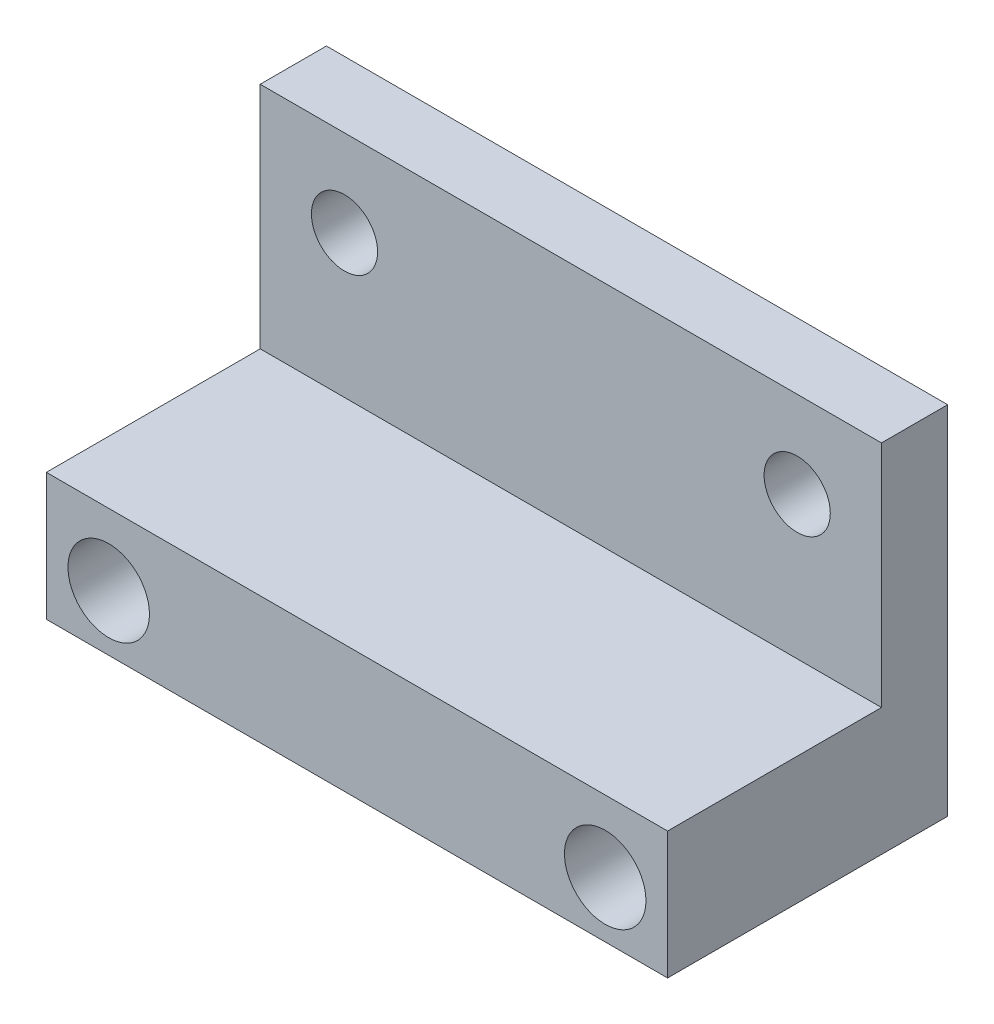
ISO-10303-21;
HEADER;
FILE_DESCRIPTION(('STEP AP214'),'2;1');
FILE_NAME('part.step','',(''),(''),'','','');
FILE_SCHEMA(('AUTOMOTIVE_DESIGN { 1 0 10303 214 1 1 1 1 }'));
ENDSEC;
DATA;
#1=APPLICATION_CONTEXT('core data for automotive mechanical design processes');
#2=APPLICATION_PROTOCOL_DEFINITION('international standard','automotive_design',2000,#1);
#3=PRODUCT_CONTEXT('',#1,'mechanical');
#4=PRODUCT('Part','Part','',(#3));
#5=PRODUCT_RELATED_PRODUCT_CATEGORY('part','',(#4));
#6=PRODUCT_DEFINITION_FORMATION('','',#4);
#7=PRODUCT_DEFINITION_CONTEXT('part definition',#1,'design');
#8=PRODUCT_DEFINITION('design','',#6,#7);
#9=PRODUCT_DEFINITION_SHAPE('','',#8);
#10=(LENGTH_UNIT() NAMED_UNIT(*) SI_UNIT(.MILLI.,.METRE.));
#11=(NAMED_UNIT(*) PLANE_ANGLE_UNIT() SI_UNIT($,.RADIAN.));
#12=(NAMED_UNIT(*) SI_UNIT($,.STERADIAN.) SOLID_ANGLE_UNIT());
#13=UNCERTAINTY_MEASURE_WITH_UNIT(LENGTH_MEASURE(1.E-05),#10,'distance_accuracy_value','');
#14=(GEOMETRIC_REPRESENTATION_CONTEXT(3) GLOBAL_UNCERTAINTY_ASSIGNED_CONTEXT((#13)) GLOBAL_UNIT_ASSIGNED_CONTEXT((#10,
#11,#12)) REPRESENTATION_CONTEXT('',''));
#15=CARTESIAN_POINT('',(0.,0.,0.));
#16=DIRECTION('',(0.,0.,1.));
#17=DIRECTION('',(1.,0.,0.));
#18=AXIS2_PLACEMENT_3D('',#15,#16,#17);
#19=CARTESIAN_POINT('',(0.,0.,2.6));
#20=DIRECTION('',(0.,0.,-1.));
#21=DIRECTION('',(-1.,0.,0.));
#22=AXIS2_PLACEMENT_3D('',#19,#20,#21);
#23=PLANE('',#22);
#24=CARTESIAN_POINT('',(8.89,10.6,2.6));
#25=DIRECTION('',(0.,0.,1.));
#26=DIRECTION('',(1.,0.,0.));
#27=AXIS2_PLACEMENT_3D('',#24,#25,#26);
#28=CIRCLE('',#27,1.3);
#29=CARTESIAN_POINT('',(10.19,10.6,2.6));
#30=VERTEX_POINT('',#29);
#31=EDGE_CURVE('E123',#30,#30,#28,.T.);
#32=ORIENTED_EDGE('',*,*,#31,.F.);
#33=EDGE_LOOP('',(#32));
#34=FACE_BOUND('',#33,.T.);
#35=CARTESIAN_POINT('',(-8.89,10.6,2.6));
#36=DIRECTION('',(0.,0.,1.));
#37=DIRECTION('',(1.,0.,0.));
#38=AXIS2_PLACEMENT_3D('',#35,#36,#37);
#39=CIRCLE('',#38,1.3);
#40=CARTESIAN_POINT('',(-7.59,10.6,2.6));
#41=VERTEX_POINT('',#40);
#42=EDGE_CURVE('E129',#41,#41,#39,.T.);
#43=ORIENTED_EDGE('',*,*,#42,.F.);
#44=EDGE_LOOP('',(#43));
#45=FACE_BOUND('',#44,.T.);
#46=DIRECTION('',(-1.,0.,0.));
#47=VECTOR('',#46,1.);
#48=CARTESIAN_POINT('',(0.,5.,2.6));
#49=LINE('',#48,#47);
#50=CARTESIAN_POINT('',(12.2,5.,2.6));
#51=VERTEX_POINT('',#50);
#52=CARTESIAN_POINT('',(-12.2,5.,2.6));
#53=VERTEX_POINT('',#52);
#54=EDGE_CURVE('E60',#51,#53,#49,.T.);
#55=ORIENTED_EDGE('',*,*,#54,.F.);
#56=DIRECTION('',(0.,1.,0.));
#57=VECTOR('',#56,1.);
#58=CARTESIAN_POINT('',(12.2,0.,2.6));
#59=LINE('',#58,#57);
#60=CARTESIAN_POINT('',(12.2,14.,2.6));
#61=VERTEX_POINT('',#60);
#62=EDGE_CURVE('E116',#51,#61,#59,.T.);
#63=ORIENTED_EDGE('',*,*,#62,.T.);
#64=DIRECTION('',(-1.,0.,0.));
#65=VECTOR('',#64,1.);
#66=CARTESIAN_POINT('',(-12.2,14.,2.6));
#67=LINE('',#66,#65);
#68=CARTESIAN_POINT('',(-12.2,14.,2.6));
#69=VERTEX_POINT('',#68);
#70=EDGE_CURVE('E138',#61,#69,#67,.T.);
#71=ORIENTED_EDGE('',*,*,#70,.T.);
#72=DIRECTION('',(0.,-1.,0.));
#73=VECTOR('',#72,1.);
#74=CARTESIAN_POINT('',(-12.2,0.,2.6));
#75=LINE('',#74,#73);
#76=EDGE_CURVE('E56',#69,#53,#75,.T.);
#77=ORIENTED_EDGE('',*,*,#76,.T.);
#78=EDGE_LOOP('',(#55,#63,#71,#77));
#79=FACE_BOUND('',#78,.T.);
#80=ADVANCED_FACE('F41',(#34,#45,#79),#23,.F.);
#81=CARTESIAN_POINT('',(0.,0.,0.));
#82=DIRECTION('',(0.,0.,-1.));
#83=DIRECTION('',(-1.,0.,0.));
#84=AXIS2_PLACEMENT_3D('',#81,#82,#83);
#85=PLANE('',#84);
#86=DIRECTION('',(1.,0.,0.));
#87=VECTOR('',#86,1.);
#88=CARTESIAN_POINT('',(-12.2,0.,0.));
#89=LINE('',#88,#87);
#90=CARTESIAN_POINT('',(-12.2,0.,0.));
#91=VERTEX_POINT('',#90);
#92=CARTESIAN_POINT('',(12.2,0.,0.));
#93=VERTEX_POINT('',#92);
#94=EDGE_CURVE('E142',#91,#93,#89,.T.);
#95=ORIENTED_EDGE('',*,*,#94,.F.);
#96=DIRECTION('',(0.,-1.,0.));
#97=VECTOR('',#96,1.);
#98=CARTESIAN_POINT('',(-12.2,0.,0.));
#99=LINE('',#98,#97);
#100=CARTESIAN_POINT('',(-12.2,14.,0.));
#101=VERTEX_POINT('',#100);
#102=EDGE_CURVE('E132',#101,#91,#99,.T.);
#103=ORIENTED_EDGE('',*,*,#102,.F.);
#104=DIRECTION('',(-1.,0.,0.));
#105=VECTOR('',#104,1.);
#106=CARTESIAN_POINT('',(-12.2,14.,0.));
#107=LINE('',#106,#105);
#108=CARTESIAN_POINT('',(12.2,14.,0.));
#109=VERTEX_POINT('',#108);
#110=EDGE_CURVE('E136',#109,#101,#107,.T.);
#111=ORIENTED_EDGE('',*,*,#110,.F.);
#112=DIRECTION('',(0.,1.,0.));
#113=VECTOR('',#112,1.);
#114=CARTESIAN_POINT('',(12.2,0.,0.));
#115=LINE('',#114,#113);
#116=EDGE_CURVE('E144',#93,#109,#115,.T.);
#117=ORIENTED_EDGE('',*,*,#116,.F.);
#118=EDGE_LOOP('',(#95,#103,#111,#117));
#119=FACE_BOUND('',#118,.T.);
#120=CARTESIAN_POINT('',(-8.89,10.6,0.));
#121=DIRECTION('',(0.,0.,1.));
#122=DIRECTION('',(1.,0.,0.));
#123=AXIS2_PLACEMENT_3D('',#120,#121,#122);
#124=CIRCLE('',#123,1.3);
#125=CARTESIAN_POINT('',(-7.59,10.6,0.));
#126=VERTEX_POINT('',#125);
#127=EDGE_CURVE('E126',#126,#126,#124,.T.);
#128=ORIENTED_EDGE('',*,*,#127,.T.);
#129=EDGE_LOOP('',(#128));
#130=FACE_BOUND('',#129,.T.);
#131=CARTESIAN_POINT('',(8.89,10.6,0.));
#132=DIRECTION('',(0.,0.,1.));
#133=DIRECTION('',(1.,0.,0.));
#134=AXIS2_PLACEMENT_3D('',#131,#132,#133);
#135=CIRCLE('',#134,1.3);
#136=CARTESIAN_POINT('',(10.19,10.6,0.));
#137=VERTEX_POINT('',#136);
#138=EDGE_CURVE('E118',#137,#137,#135,.T.);
#139=ORIENTED_EDGE('',*,*,#138,.T.);
#140=EDGE_LOOP('',(#139));
#141=FACE_BOUND('',#140,.T.);
#142=ADVANCED_FACE('F156',(#119,#130,#141),#85,.T.);
#143=CARTESIAN_POINT('',(-12.2,0.,2.6));
#144=DIRECTION('',(1.,0.,0.));
#145=DIRECTION('',(0.,0.,-1.));
#146=AXIS2_PLACEMENT_3D('',#143,#144,#145);
#147=PLANE('',#146);
#148=DIRECTION('',(0.,0.,-1.));
#149=VECTOR('',#148,1.);
#150=CARTESIAN_POINT('',(-12.2,0.,2.6));
#151=LINE('',#150,#149);
#152=CARTESIAN_POINT('',(-12.2,0.,11.));
#153=VERTEX_POINT('',#152);
#154=EDGE_CURVE('E11',#153,#91,#151,.T.);
#155=ORIENTED_EDGE('',*,*,#154,.F.);
#156=DIRECTION('',(0.,-1.,0.));
#157=VECTOR('',#156,1.);
#158=CARTESIAN_POINT('',(-12.2,5.,11.));
#159=LINE('',#158,#157);
#160=CARTESIAN_POINT('',(-12.2,5.,11.));
#161=VERTEX_POINT('',#160);
#162=EDGE_CURVE('E102',#161,#153,#159,.T.);
#163=ORIENTED_EDGE('',*,*,#162,.F.);
#164=DIRECTION('',(0.,0.,-1.));
#165=VECTOR('',#164,1.);
#166=CARTESIAN_POINT('',(-12.2,5.,11.));
#167=LINE('',#166,#165);
#168=EDGE_CURVE('E98',#161,#53,#167,.T.);
#169=ORIENTED_EDGE('',*,*,#168,.T.);
#170=ORIENTED_EDGE('',*,*,#76,.F.);
#171=DIRECTION('',(0.,0.,-1.));
#172=VECTOR('',#171,1.);
#173=CARTESIAN_POINT('',(-12.2,14.,2.6));
#174=LINE('',#173,#172);
#175=EDGE_CURVE('E140',#69,#101,#174,.T.);
#176=ORIENTED_EDGE('',*,*,#175,.T.);
#177=ORIENTED_EDGE('',*,*,#102,.T.);
#178=EDGE_LOOP('',(#155,#163,#169,#170,#176,#177));
#179=FACE_BOUND('',#178,.T.);
#180=ADVANCED_FACE('F43',(#179),#147,.F.);
#181=CARTESIAN_POINT('',(-12.2,0.,2.6));
#182=DIRECTION('',(0.,1.,0.));
#183=DIRECTION('',(-1.,0.,0.));
#184=AXIS2_PLACEMENT_3D('',#181,#182,#183);
#185=PLANE('',#184);
#186=ORIENTED_EDGE('',*,*,#94,.T.);
#187=DIRECTION('',(0.,0.,-1.));
#188=VECTOR('',#187,1.);
#189=CARTESIAN_POINT('',(12.2,0.,2.6));
#190=LINE('',#189,#188);
#191=CARTESIAN_POINT('',(12.2,0.,11.));
#192=VERTEX_POINT('',#191);
#193=EDGE_CURVE('E49',#192,#93,#190,.T.);
#194=ORIENTED_EDGE('',*,*,#193,.F.);
#195=DIRECTION('',(1.,0.,0.));
#196=VECTOR('',#195,1.);
#197=CARTESIAN_POINT('',(12.2,0.,11.));
#198=LINE('',#197,#196);
#199=EDGE_CURVE('E109',#153,#192,#198,.T.);
#200=ORIENTED_EDGE('',*,*,#199,.F.);
#201=ORIENTED_EDGE('',*,*,#154,.T.);
#202=EDGE_LOOP('',(#186,#194,#200,#201));
#203=FACE_BOUND('',#202,.T.);
#204=ADVANCED_FACE('F218',(#203),#185,.F.);
#205=CARTESIAN_POINT('',(12.2,0.,2.6));
#206=DIRECTION('',(-1.,0.,0.));
#207=DIRECTION('',(0.,-1.,0.));
#208=AXIS2_PLACEMENT_3D('',#205,#206,#207);
#209=PLANE('',#208);
#210=ORIENTED_EDGE('',*,*,#116,.T.);
#211=DIRECTION('',(0.,0.,-1.));
#212=VECTOR('',#211,1.);
#213=CARTESIAN_POINT('',(12.2,14.,2.6));
#214=LINE('',#213,#212);
#215=EDGE_CURVE('E149',#61,#109,#214,.T.);
#216=ORIENTED_EDGE('',*,*,#215,.F.);
#217=ORIENTED_EDGE('',*,*,#62,.F.);
#218=DIRECTION('',(0.,0.,-1.));
#219=VECTOR('',#218,1.);
#220=CARTESIAN_POINT('',(12.2,5.,11.));
#221=LINE('',#220,#219);
#222=CARTESIAN_POINT('',(12.2,5.,11.));
#223=VERTEX_POINT('',#222);
#224=EDGE_CURVE('E96',#223,#51,#221,.T.);
#225=ORIENTED_EDGE('',*,*,#224,.F.);
#226=DIRECTION('',(0.,1.,0.));
#227=VECTOR('',#226,1.);
#228=CARTESIAN_POINT('',(12.2,5.,11.));
#229=LINE('',#228,#227);
#230=EDGE_CURVE('E103',#192,#223,#229,.T.);
#231=ORIENTED_EDGE('',*,*,#230,.F.);
#232=ORIENTED_EDGE('',*,*,#193,.T.);
#233=EDGE_LOOP('',(#210,#216,#217,#225,#231,#232));
#234=FACE_BOUND('',#233,.T.);
#235=ADVANCED_FACE('F114',(#234),#209,.F.);
#236=CARTESIAN_POINT('',(-12.2,14.,2.6));
#237=DIRECTION('',(0.,-1.,0.));
#238=DIRECTION('',(1.,0.,0.));
#239=AXIS2_PLACEMENT_3D('',#236,#237,#238);
#240=PLANE('',#239);
#241=ORIENTED_EDGE('',*,*,#110,.T.);
#242=ORIENTED_EDGE('',*,*,#175,.F.);
#243=ORIENTED_EDGE('',*,*,#70,.F.);
#244=ORIENTED_EDGE('',*,*,#215,.T.);
#245=EDGE_LOOP('',(#241,#242,#243,#244));
#246=FACE_BOUND('',#245,.T.);
#247=ADVANCED_FACE('F161',(#246),#240,.F.);
#248=CARTESIAN_POINT('',(-8.89,10.6,2.6));
#249=DIRECTION('',(0.,0.,-1.));
#250=DIRECTION('',(-1.,0.,0.));
#251=AXIS2_PLACEMENT_3D('',#248,#249,#250);
#252=CYLINDRICAL_SURFACE('',#251,1.3);
#253=ORIENTED_EDGE('',*,*,#42,.T.);
#254=EDGE_LOOP('',(#253));
#255=FACE_BOUND('',#254,.T.);
#256=ORIENTED_EDGE('',*,*,#127,.F.);
#257=EDGE_LOOP('',(#256));
#258=FACE_BOUND('',#257,.T.);
#259=ADVANCED_FACE('F212',(#255,#258),#252,.F.);
#260=CARTESIAN_POINT('',(8.89,10.6,2.6));
#261=DIRECTION('',(0.,0.,-1.));
#262=DIRECTION('',(-1.,0.,0.));
#263=AXIS2_PLACEMENT_3D('',#260,#261,#262);
#264=CYLINDRICAL_SURFACE('',#263,1.3);
#265=ORIENTED_EDGE('',*,*,#31,.T.);
#266=EDGE_LOOP('',(#265));
#267=FACE_BOUND('',#266,.T.);
#268=ORIENTED_EDGE('',*,*,#138,.F.);
#269=EDGE_LOOP('',(#268));
#270=FACE_BOUND('',#269,.T.);
#271=ADVANCED_FACE('F242',(#267,#270),#264,.F.);
#272=CARTESIAN_POINT('',(12.2,5.,11.));
#273=DIRECTION('',(0.,-1.,0.));
#274=DIRECTION('',(1.,0.,0.));
#275=AXIS2_PLACEMENT_3D('',#272,#273,#274);
#276=PLANE('',#275);
#277=ORIENTED_EDGE('',*,*,#224,.T.);
#278=ORIENTED_EDGE('',*,*,#54,.T.);
#279=ORIENTED_EDGE('',*,*,#168,.F.);
#280=DIRECTION('',(-1.,0.,0.));
#281=VECTOR('',#280,1.);
#282=CARTESIAN_POINT('',(12.2,5.,11.));
#283=LINE('',#282,#281);
#284=EDGE_CURVE('E92',#223,#161,#283,.T.);
#285=ORIENTED_EDGE('',*,*,#284,.F.);
#286=EDGE_LOOP('',(#277,#278,#279,#285));
#287=FACE_BOUND('',#286,.T.);
#288=ADVANCED_FACE('F94',(#287),#276,.F.);
#289=CARTESIAN_POINT('',(0.,0.,11.));
#290=DIRECTION('',(0.,0.,-1.));
#291=DIRECTION('',(-1.,0.,0.));
#292=AXIS2_PLACEMENT_3D('',#289,#290,#291);
#293=PLANE('',#292);
#294=CARTESIAN_POINT('',(-9.75,2.2,11.));
#295=DIRECTION('',(0.,0.,1.));
#296=DIRECTION('',(1.,0.,0.));
#297=AXIS2_PLACEMENT_3D('',#294,#295,#296);
#298=CIRCLE('',#297,1.6);
#299=CARTESIAN_POINT('',(-8.15,2.2,11.));
#300=VERTEX_POINT('',#299);
#301=EDGE_CURVE('E172',#300,#300,#298,.T.);
#302=ORIENTED_EDGE('',*,*,#301,.F.);
#303=EDGE_LOOP('',(#302));
#304=FACE_BOUND('',#303,.T.);
#305=CARTESIAN_POINT('',(9.75,2.2,11.));
#306=DIRECTION('',(0.,0.,1.));
#307=DIRECTION('',(1.,0.,0.));
#308=AXIS2_PLACEMENT_3D('',#305,#306,#307);
#309=CIRCLE('',#308,1.6);
#310=CARTESIAN_POINT('',(11.35,2.2,11.));
#311=VERTEX_POINT('',#310);
#312=EDGE_CURVE('E169',#311,#311,#309,.T.);
#313=ORIENTED_EDGE('',*,*,#312,.F.);
#314=EDGE_LOOP('',(#313));
#315=FACE_BOUND('',#314,.T.);
#316=ORIENTED_EDGE('',*,*,#230,.T.);
#317=ORIENTED_EDGE('',*,*,#284,.T.);
#318=ORIENTED_EDGE('',*,*,#162,.T.);
#319=ORIENTED_EDGE('',*,*,#199,.T.);
#320=EDGE_LOOP('',(#316,#317,#318,#319));
#321=FACE_BOUND('',#320,.T.);
#322=ADVANCED_FACE('F107',(#304,#315,#321),#293,.F.);
#323=CARTESIAN_POINT('',(9.75,2.2,6.4));
#324=DIRECTION('',(0.,0.,1.));
#325=DIRECTION('',(1.,0.,0.));
#326=AXIS2_PLACEMENT_3D('',#323,#324,#325);
#327=CYLINDRICAL_SURFACE('',#326,1.6);
#328=CARTESIAN_POINT('',(9.75,2.2,6.4));
#329=DIRECTION('',(0.,0.,1.));
#330=DIRECTION('',(1.,0.,0.));
#331=AXIS2_PLACEMENT_3D('',#328,#329,#330);
#332=CIRCLE('',#331,1.6);
#333=CARTESIAN_POINT('',(11.35,2.2,6.4));
#334=VERTEX_POINT('',#333);
#335=EDGE_CURVE('E166',#334,#334,#332,.T.);
#336=ORIENTED_EDGE('',*,*,#335,.F.);
#337=EDGE_LOOP('',(#336));
#338=FACE_BOUND('',#337,.T.);
#339=ORIENTED_EDGE('',*,*,#312,.T.);
#340=EDGE_LOOP('',(#339));
#341=FACE_BOUND('',#340,.T.);
#342=ADVANCED_FACE('F189',(#338,#341),#327,.F.);
#343=CARTESIAN_POINT('',(9.75,2.2,6.4));
#344=DIRECTION('',(0.,0.,1.));
#345=DIRECTION('',(1.,0.,0.));
#346=AXIS2_PLACEMENT_3D('',#343,#344,#345);
#347=PLANE('',#346);
#348=ORIENTED_EDGE('',*,*,#335,.T.);
#349=EDGE_LOOP('',(#348));
#350=FACE_BOUND('',#349,.T.);
#351=ADVANCED_FACE('F183',(#350),#347,.T.);
#352=CARTESIAN_POINT('',(-9.75,2.2,6.4));
#353=DIRECTION('',(0.,0.,1.));
#354=DIRECTION('',(1.,0.,0.));
#355=AXIS2_PLACEMENT_3D('',#352,#353,#354);
#356=CYLINDRICAL_SURFACE('',#355,1.6);
#357=CARTESIAN_POINT('',(-9.75,2.2,6.4));
#358=DIRECTION('',(0.,0.,1.));
#359=DIRECTION('',(1.,0.,0.));
#360=AXIS2_PLACEMENT_3D('',#357,#358,#359);
#361=CIRCLE('',#360,1.6);
#362=CARTESIAN_POINT('',(-8.15,2.2,6.4));
#363=VERTEX_POINT('',#362);
#364=EDGE_CURVE('E112',#363,#363,#361,.T.);
#365=ORIENTED_EDGE('',*,*,#364,.F.);
#366=EDGE_LOOP('',(#365));
#367=FACE_BOUND('',#366,.T.);
#368=ORIENTED_EDGE('',*,*,#301,.T.);
#369=EDGE_LOOP('',(#368));
#370=FACE_BOUND('',#369,.T.);
#371=ADVANCED_FACE('F180',(#367,#370),#356,.F.);
#372=CARTESIAN_POINT('',(-9.75,2.2,6.4));
#373=DIRECTION('',(0.,0.,1.));
#374=DIRECTION('',(1.,0.,0.));
#375=AXIS2_PLACEMENT_3D('',#372,#373,#374);
#376=PLANE('',#375);
#377=ORIENTED_EDGE('',*,*,#364,.T.);
#378=EDGE_LOOP('',(#377));
#379=FACE_BOUND('',#378,.T.);
#380=ADVANCED_FACE('F178',(#379),#376,.T.);
#381=CLOSED_SHELL('',(#80,#142,#180,#204,#235,#247,#259,#271,#288,#322,#342,#351,#371,#380));
#382=MANIFOLD_SOLID_BREP('B2',#381);
#383=ADVANCED_BREP_SHAPE_REPRESENTATION('',(#18,#382),#14);
#384=SHAPE_DEFINITION_REPRESENTATION(#9,#383);
ENDSEC;
END-ISO-10303-21;
